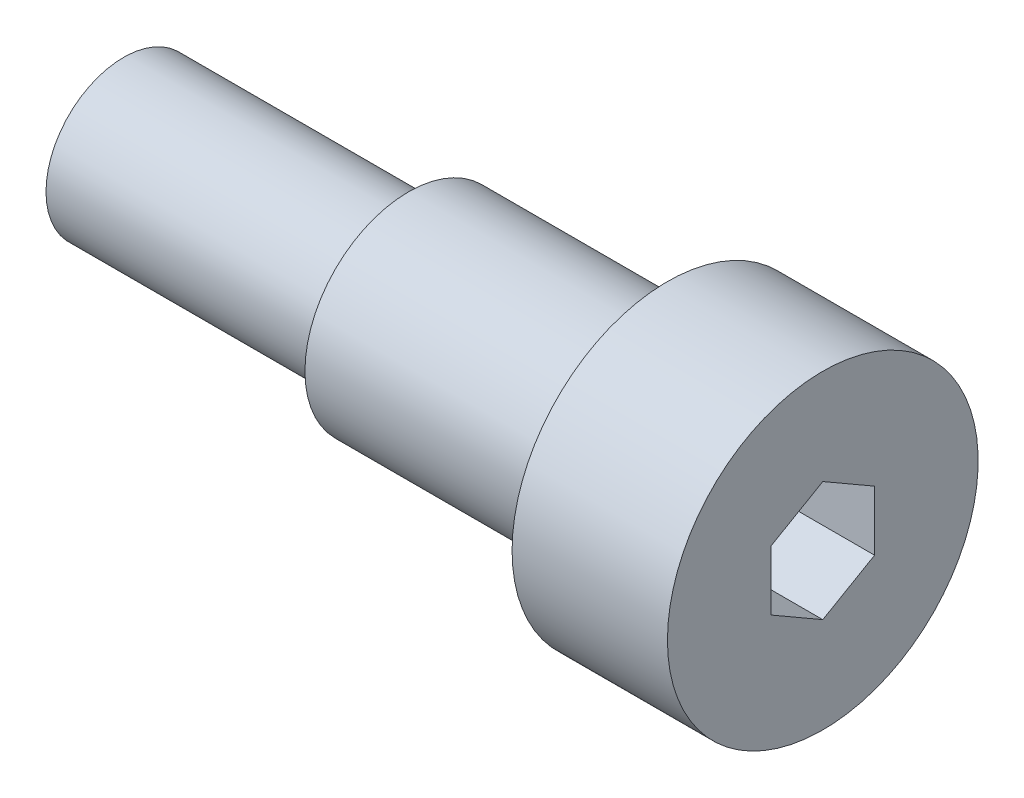
ISO-10303-21;
HEADER;
FILE_DESCRIPTION(('STEP AP214'),'2;1');
FILE_NAME('part.step','',(''),(''),'','','');
FILE_SCHEMA(('AUTOMOTIVE_DESIGN { 1 0 10303 214 1 1 1 1 }'));
ENDSEC;
DATA;
#1=APPLICATION_CONTEXT('core data for automotive mechanical design processes');
#2=APPLICATION_PROTOCOL_DEFINITION('international standard','automotive_design',2000,#1);
#3=PRODUCT_CONTEXT('',#1,'mechanical');
#4=PRODUCT('Part','Part','',(#3));
#5=PRODUCT_RELATED_PRODUCT_CATEGORY('part','',(#4));
#6=PRODUCT_DEFINITION_FORMATION('','',#4);
#7=PRODUCT_DEFINITION_CONTEXT('part definition',#1,'design');
#8=PRODUCT_DEFINITION('design','',#6,#7);
#9=PRODUCT_DEFINITION_SHAPE('','',#8);
#10=(LENGTH_UNIT() NAMED_UNIT(*) SI_UNIT(.MILLI.,.METRE.));
#11=(NAMED_UNIT(*) PLANE_ANGLE_UNIT() SI_UNIT($,.RADIAN.));
#12=(NAMED_UNIT(*) SI_UNIT($,.STERADIAN.) SOLID_ANGLE_UNIT());
#13=UNCERTAINTY_MEASURE_WITH_UNIT(LENGTH_MEASURE(1.E-05),#10,'distance_accuracy_value','');
#14=(GEOMETRIC_REPRESENTATION_CONTEXT(3) GLOBAL_UNCERTAINTY_ASSIGNED_CONTEXT((#13)) GLOBAL_UNIT_ASSIGNED_CONTEXT((#10,
#11,#12)) REPRESENTATION_CONTEXT('',''));
#15=CARTESIAN_POINT('',(0.,0.,0.));
#16=DIRECTION('',(0.,0.,1.));
#17=DIRECTION('',(1.,0.,0.));
#18=AXIS2_PLACEMENT_3D('',#15,#16,#17);
#19=CARTESIAN_POINT('',(16.,0.,0.));
#20=DIRECTION('',(-1.,0.,0.));
#21=DIRECTION('',(0.,0.,1.));
#22=AXIS2_PLACEMENT_3D('',#19,#20,#21);
#23=PLANE('',#22);
#24=DIRECTION('',(0.,-0.5,0.866025403784439));
#25=VECTOR('',#24,1.);
#26=CARTESIAN_POINT('',(16.,2.3094010767585,0.));
#27=LINE('',#26,#25);
#28=CARTESIAN_POINT('',(16.,2.3094010767585,0.));
#29=VERTEX_POINT('',#28);
#30=CARTESIAN_POINT('',(16.,1.15470053837925,2.));
#31=VERTEX_POINT('',#30);
#32=EDGE_CURVE('E125',#29,#31,#27,.T.);
#33=ORIENTED_EDGE('',*,*,#32,.F.);
#34=DIRECTION('',(0.,0.5,0.866025403784439));
#35=VECTOR('',#34,1.);
#36=CARTESIAN_POINT('',(16.,1.15470053837925,-2.));
#37=LINE('',#36,#35);
#38=CARTESIAN_POINT('',(16.,1.15470053837925,-2.));
#39=VERTEX_POINT('',#38);
#40=EDGE_CURVE('E51',#39,#29,#37,.T.);
#41=ORIENTED_EDGE('',*,*,#40,.F.);
#42=DIRECTION('',(0.,1.,0.));
#43=VECTOR('',#42,1.);
#44=CARTESIAN_POINT('',(16.,-1.15470053837925,-2.));
#45=LINE('',#44,#43);
#46=CARTESIAN_POINT('',(16.,-1.15470053837925,-2.));
#47=VERTEX_POINT('',#46);
#48=EDGE_CURVE('E134',#47,#39,#45,.T.);
#49=ORIENTED_EDGE('',*,*,#48,.F.);
#50=DIRECTION('',(0.,0.5,-0.866025403784439));
#51=VECTOR('',#50,1.);
#52=CARTESIAN_POINT('',(16.,-2.3094010767585,0.));
#53=LINE('',#52,#51);
#54=CARTESIAN_POINT('',(16.,-2.3094010767585,0.));
#55=VERTEX_POINT('',#54);
#56=EDGE_CURVE('E132',#55,#47,#53,.T.);
#57=ORIENTED_EDGE('',*,*,#56,.F.);
#58=DIRECTION('',(0.,-0.5,-0.866025403784439));
#59=VECTOR('',#58,1.);
#60=CARTESIAN_POINT('',(16.,-1.15470053837925,2.));
#61=LINE('',#60,#59);
#62=CARTESIAN_POINT('',(16.,-1.15470053837925,2.));
#63=VERTEX_POINT('',#62);
#64=EDGE_CURVE('E99',#63,#55,#61,.T.);
#65=ORIENTED_EDGE('',*,*,#64,.F.);
#66=DIRECTION('',(0.,-1.,0.));
#67=VECTOR('',#66,1.);
#68=CARTESIAN_POINT('',(16.,1.15470053837925,2.));
#69=LINE('',#68,#67);
#70=EDGE_CURVE('E128',#31,#63,#69,.T.);
#71=ORIENTED_EDGE('',*,*,#70,.F.);
#72=EDGE_LOOP('',(#33,#41,#49,#57,#65,#71));
#73=FACE_BOUND('',#72,.T.);
#74=CARTESIAN_POINT('',(16.,0.,0.));
#75=DIRECTION('',(-1.,0.,0.));
#76=DIRECTION('',(0.,0.,1.));
#77=AXIS2_PLACEMENT_3D('',#74,#75,#76);
#78=CIRCLE('',#77,6.);
#79=CARTESIAN_POINT('',(16.,0.,6.));
#80=VERTEX_POINT('',#79);
#81=EDGE_CURVE('E11',#80,#80,#78,.T.);
#82=ORIENTED_EDGE('',*,*,#81,.F.);
#83=EDGE_LOOP('',(#82));
#84=FACE_BOUND('',#83,.T.);
#85=ADVANCED_FACE('F37',(#73,#84),#23,.F.);
#86=CARTESIAN_POINT('',(0.,0.,0.));
#87=DIRECTION('',(-1.,0.,0.));
#88=DIRECTION('',(0.,0.,1.));
#89=AXIS2_PLACEMENT_3D('',#86,#87,#88);
#90=CYLINDRICAL_SURFACE('',#89,6.);
#91=CARTESIAN_POINT('',(10.,0.,0.));
#92=DIRECTION('',(-1.,0.,0.));
#93=DIRECTION('',(0.,0.,1.));
#94=AXIS2_PLACEMENT_3D('',#91,#92,#93);
#95=CIRCLE('',#94,6.);
#96=CARTESIAN_POINT('',(10.,0.,6.));
#97=VERTEX_POINT('',#96);
#98=EDGE_CURVE('E44',#97,#97,#95,.T.);
#99=ORIENTED_EDGE('',*,*,#98,.F.);
#100=EDGE_LOOP('',(#99));
#101=FACE_BOUND('',#100,.T.);
#102=ORIENTED_EDGE('',*,*,#81,.T.);
#103=EDGE_LOOP('',(#102));
#104=FACE_BOUND('',#103,.T.);
#105=ADVANCED_FACE('F159',(#101,#104),#90,.T.);
#106=CARTESIAN_POINT('',(10.,6.,0.));
#107=DIRECTION('',(1.,0.,0.));
#108=DIRECTION('',(0.,0.,-1.));
#109=AXIS2_PLACEMENT_3D('',#106,#107,#108);
#110=PLANE('',#109);
#111=CARTESIAN_POINT('',(10.,0.,0.));
#112=DIRECTION('',(-1.,0.,0.));
#113=DIRECTION('',(0.,0.,1.));
#114=AXIS2_PLACEMENT_3D('',#111,#112,#113);
#115=CIRCLE('',#114,4.);
#116=CARTESIAN_POINT('',(10.,0.,4.));
#117=VERTEX_POINT('',#116);
#118=EDGE_CURVE('E152',#117,#117,#115,.T.);
#119=ORIENTED_EDGE('',*,*,#118,.F.);
#120=EDGE_LOOP('',(#119));
#121=FACE_BOUND('',#120,.T.);
#122=ORIENTED_EDGE('',*,*,#98,.T.);
#123=EDGE_LOOP('',(#122));
#124=FACE_BOUND('',#123,.T.);
#125=ADVANCED_FACE('F157',(#121,#124),#110,.F.);
#126=CARTESIAN_POINT('',(0.,0.,0.));
#127=DIRECTION('',(-1.,0.,0.));
#128=DIRECTION('',(0.,0.,1.));
#129=AXIS2_PLACEMENT_3D('',#126,#127,#128);
#130=CYLINDRICAL_SURFACE('',#129,4.);
#131=CARTESIAN_POINT('',(0.,0.,0.));
#132=DIRECTION('',(-1.,0.,0.));
#133=DIRECTION('',(0.,0.,1.));
#134=AXIS2_PLACEMENT_3D('',#131,#132,#133);
#135=CIRCLE('',#134,4.);
#136=CARTESIAN_POINT('',(0.,0.,4.));
#137=VERTEX_POINT('',#136);
#138=EDGE_CURVE('E149',#137,#137,#135,.T.);
#139=ORIENTED_EDGE('',*,*,#138,.F.);
#140=EDGE_LOOP('',(#139));
#141=FACE_BOUND('',#140,.T.);
#142=ORIENTED_EDGE('',*,*,#118,.T.);
#143=EDGE_LOOP('',(#142));
#144=FACE_BOUND('',#143,.T.);
#145=ADVANCED_FACE('F196',(#141,#144),#130,.T.);
#146=CARTESIAN_POINT('',(0.,4.,0.));
#147=DIRECTION('',(1.,0.,0.));
#148=DIRECTION('',(0.,0.,-1.));
#149=AXIS2_PLACEMENT_3D('',#146,#147,#148);
#150=PLANE('',#149);
#151=CARTESIAN_POINT('',(0.,0.,0.));
#152=DIRECTION('',(-1.,0.,0.));
#153=DIRECTION('',(0.,0.,1.));
#154=AXIS2_PLACEMENT_3D('',#151,#152,#153);
#155=CIRCLE('',#154,3.);
#156=CARTESIAN_POINT('',(0.,0.,3.));
#157=VERTEX_POINT('',#156);
#158=EDGE_CURVE('E146',#157,#157,#155,.T.);
#159=ORIENTED_EDGE('',*,*,#158,.F.);
#160=EDGE_LOOP('',(#159));
#161=FACE_BOUND('',#160,.T.);
#162=ORIENTED_EDGE('',*,*,#138,.T.);
#163=EDGE_LOOP('',(#162));
#164=FACE_BOUND('',#163,.T.);
#165=ADVANCED_FACE('F192',(#161,#164),#150,.F.);
#166=CARTESIAN_POINT('',(0.,0.,0.));
#167=DIRECTION('',(-1.,0.,0.));
#168=DIRECTION('',(0.,0.,1.));
#169=AXIS2_PLACEMENT_3D('',#166,#167,#168);
#170=CYLINDRICAL_SURFACE('',#169,3.);
#171=CARTESIAN_POINT('',(-11.,0.,0.));
#172=DIRECTION('',(-1.,0.,0.));
#173=DIRECTION('',(0.,0.,1.));
#174=AXIS2_PLACEMENT_3D('',#171,#172,#173);
#175=CIRCLE('',#174,3.);
#176=CARTESIAN_POINT('',(-11.,0.,3.));
#177=VERTEX_POINT('',#176);
#178=EDGE_CURVE('E138',#177,#177,#175,.T.);
#179=ORIENTED_EDGE('',*,*,#178,.F.);
#180=EDGE_LOOP('',(#179));
#181=FACE_BOUND('',#180,.T.);
#182=ORIENTED_EDGE('',*,*,#158,.T.);
#183=EDGE_LOOP('',(#182));
#184=FACE_BOUND('',#183,.T.);
#185=ADVANCED_FACE('F184',(#181,#184),#170,.T.);
#186=CARTESIAN_POINT('',(-11.,3.,0.));
#187=DIRECTION('',(1.,0.,0.));
#188=DIRECTION('',(0.,0.,-1.));
#189=AXIS2_PLACEMENT_3D('',#186,#187,#188);
#190=PLANE('',#189);
#191=ORIENTED_EDGE('',*,*,#178,.T.);
#192=EDGE_LOOP('',(#191));
#193=FACE_BOUND('',#192,.T.);
#194=ADVANCED_FACE('F177',(#193),#190,.F.);
#195=CARTESIAN_POINT('',(12.,1.15470053837925,-2.));
#196=DIRECTION('',(0.,0.866025403784439,-0.5));
#197=DIRECTION('',(0.,0.5,0.866025403784439));
#198=AXIS2_PLACEMENT_3D('',#195,#196,#197);
#199=PLANE('',#198);
#200=ORIENTED_EDGE('',*,*,#40,.T.);
#201=DIRECTION('',(1.,0.,0.));
#202=VECTOR('',#201,1.);
#203=CARTESIAN_POINT('',(12.,2.3094010767585,0.));
#204=LINE('',#203,#202);
#205=CARTESIAN_POINT('',(12.,2.3094010767585,0.));
#206=VERTEX_POINT('',#205);
#207=EDGE_CURVE('E81',#206,#29,#204,.T.);
#208=ORIENTED_EDGE('',*,*,#207,.F.);
#209=DIRECTION('',(0.,0.5,0.866025403784439));
#210=VECTOR('',#209,1.);
#211=CARTESIAN_POINT('',(12.,1.15470053837925,-2.));
#212=LINE('',#211,#210);
#213=CARTESIAN_POINT('',(12.,1.15470053837925,-2.));
#214=VERTEX_POINT('',#213);
#215=EDGE_CURVE('E136',#214,#206,#212,.T.);
#216=ORIENTED_EDGE('',*,*,#215,.F.);
#217=DIRECTION('',(1.,0.,0.));
#218=VECTOR('',#217,1.);
#219=CARTESIAN_POINT('',(12.,1.15470053837925,-2.));
#220=LINE('',#219,#218);
#221=EDGE_CURVE('E59',#214,#39,#220,.T.);
#222=ORIENTED_EDGE('',*,*,#221,.T.);
#223=EDGE_LOOP('',(#200,#208,#216,#222));
#224=FACE_BOUND('',#223,.T.);
#225=ADVANCED_FACE('F174',(#224),#199,.F.);
#226=CARTESIAN_POINT('',(12.,-1.15470053837925,-2.));
#227=DIRECTION('',(0.,0.,-1.));
#228=DIRECTION('',(-1.,0.,0.));
#229=AXIS2_PLACEMENT_3D('',#226,#227,#228);
#230=PLANE('',#229);
#231=ORIENTED_EDGE('',*,*,#48,.T.);
#232=ORIENTED_EDGE('',*,*,#221,.F.);
#233=DIRECTION('',(0.,1.,0.));
#234=VECTOR('',#233,1.);
#235=CARTESIAN_POINT('',(12.,-1.15470053837925,-2.));
#236=LINE('',#235,#234);
#237=CARTESIAN_POINT('',(12.,-1.15470053837925,-2.));
#238=VERTEX_POINT('',#237);
#239=EDGE_CURVE('E111',#238,#214,#236,.T.);
#240=ORIENTED_EDGE('',*,*,#239,.F.);
#241=DIRECTION('',(1.,0.,0.));
#242=VECTOR('',#241,1.);
#243=CARTESIAN_POINT('',(12.,-1.15470053837925,-2.));
#244=LINE('',#243,#242);
#245=EDGE_CURVE('E103',#238,#47,#244,.T.);
#246=ORIENTED_EDGE('',*,*,#245,.T.);
#247=EDGE_LOOP('',(#231,#232,#240,#246));
#248=FACE_BOUND('',#247,.T.);
#249=ADVANCED_FACE('F176',(#248),#230,.F.);
#250=CARTESIAN_POINT('',(12.,-2.3094010767585,0.));
#251=DIRECTION('',(0.,-0.866025403784439,-0.5));
#252=DIRECTION('',(0.,0.5,-0.866025403784439));
#253=AXIS2_PLACEMENT_3D('',#250,#251,#252);
#254=PLANE('',#253);
#255=ORIENTED_EDGE('',*,*,#56,.T.);
#256=ORIENTED_EDGE('',*,*,#245,.F.);
#257=DIRECTION('',(0.,0.5,-0.866025403784439));
#258=VECTOR('',#257,1.);
#259=CARTESIAN_POINT('',(12.,-2.3094010767585,0.));
#260=LINE('',#259,#258);
#261=CARTESIAN_POINT('',(12.,-2.3094010767585,0.));
#262=VERTEX_POINT('',#261);
#263=EDGE_CURVE('E107',#262,#238,#260,.T.);
#264=ORIENTED_EDGE('',*,*,#263,.F.);
#265=DIRECTION('',(1.,0.,0.));
#266=VECTOR('',#265,1.);
#267=CARTESIAN_POINT('',(12.,-2.3094010767585,0.));
#268=LINE('',#267,#266);
#269=EDGE_CURVE('E92',#262,#55,#268,.T.);
#270=ORIENTED_EDGE('',*,*,#269,.T.);
#271=EDGE_LOOP('',(#255,#256,#264,#270));
#272=FACE_BOUND('',#271,.T.);
#273=ADVANCED_FACE('F108',(#272),#254,.F.);
#274=CARTESIAN_POINT('',(12.,-1.15470053837925,2.));
#275=DIRECTION('',(0.,-0.866025403784439,0.5));
#276=DIRECTION('',(0.,-0.5,-0.866025403784439));
#277=AXIS2_PLACEMENT_3D('',#274,#275,#276);
#278=PLANE('',#277);
#279=ORIENTED_EDGE('',*,*,#64,.T.);
#280=ORIENTED_EDGE('',*,*,#269,.F.);
#281=DIRECTION('',(0.,-0.5,-0.866025403784439));
#282=VECTOR('',#281,1.);
#283=CARTESIAN_POINT('',(12.,-1.15470053837925,2.));
#284=LINE('',#283,#282);
#285=CARTESIAN_POINT('',(12.,-1.15470053837925,2.));
#286=VERTEX_POINT('',#285);
#287=EDGE_CURVE('E96',#286,#262,#284,.T.);
#288=ORIENTED_EDGE('',*,*,#287,.F.);
#289=DIRECTION('',(1.,0.,0.));
#290=VECTOR('',#289,1.);
#291=CARTESIAN_POINT('',(12.,-1.15470053837925,2.));
#292=LINE('',#291,#290);
#293=EDGE_CURVE('E104',#286,#63,#292,.T.);
#294=ORIENTED_EDGE('',*,*,#293,.T.);
#295=EDGE_LOOP('',(#279,#280,#288,#294));
#296=FACE_BOUND('',#295,.T.);
#297=ADVANCED_FACE('F94',(#296),#278,.F.);
#298=CARTESIAN_POINT('',(12.,1.15470053837925,2.));
#299=DIRECTION('',(0.,0.,1.));
#300=DIRECTION('',(1.,0.,0.));
#301=AXIS2_PLACEMENT_3D('',#298,#299,#300);
#302=PLANE('',#301);
#303=ORIENTED_EDGE('',*,*,#70,.T.);
#304=ORIENTED_EDGE('',*,*,#293,.F.);
#305=DIRECTION('',(0.,-1.,0.));
#306=VECTOR('',#305,1.);
#307=CARTESIAN_POINT('',(12.,1.15470053837925,2.));
#308=LINE('',#307,#306);
#309=CARTESIAN_POINT('',(12.,1.15470053837925,2.));
#310=VERTEX_POINT('',#309);
#311=EDGE_CURVE('E117',#310,#286,#308,.T.);
#312=ORIENTED_EDGE('',*,*,#311,.F.);
#313=DIRECTION('',(1.,0.,0.));
#314=VECTOR('',#313,1.);
#315=CARTESIAN_POINT('',(12.,1.15470053837925,2.));
#316=LINE('',#315,#314);
#317=EDGE_CURVE('E141',#310,#31,#316,.T.);
#318=ORIENTED_EDGE('',*,*,#317,.T.);
#319=EDGE_LOOP('',(#303,#304,#312,#318));
#320=FACE_BOUND('',#319,.T.);
#321=ADVANCED_FACE('F259',(#320),#302,.F.);
#322=CARTESIAN_POINT('',(12.,2.3094010767585,0.));
#323=DIRECTION('',(0.,0.866025403784439,0.5));
#324=DIRECTION('',(0.,-0.5,0.866025403784439));
#325=AXIS2_PLACEMENT_3D('',#322,#323,#324);
#326=PLANE('',#325);
#327=ORIENTED_EDGE('',*,*,#32,.T.);
#328=ORIENTED_EDGE('',*,*,#317,.F.);
#329=DIRECTION('',(0.,-0.5,0.866025403784439));
#330=VECTOR('',#329,1.);
#331=CARTESIAN_POINT('',(12.,2.3094010767585,0.));
#332=LINE('',#331,#330);
#333=EDGE_CURVE('E119',#206,#310,#332,.T.);
#334=ORIENTED_EDGE('',*,*,#333,.F.);
#335=ORIENTED_EDGE('',*,*,#207,.T.);
#336=EDGE_LOOP('',(#327,#328,#334,#335));
#337=FACE_BOUND('',#336,.T.);
#338=ADVANCED_FACE('F172',(#337),#326,.F.);
#339=CARTESIAN_POINT('',(12.,3.46410161513775,2.));
#340=DIRECTION('',(1.,0.,0.));
#341=DIRECTION('',(0.,0.,-1.));
#342=AXIS2_PLACEMENT_3D('',#339,#340,#341);
#343=PLANE('',#342);
#344=ORIENTED_EDGE('',*,*,#215,.T.);
#345=ORIENTED_EDGE('',*,*,#333,.T.);
#346=ORIENTED_EDGE('',*,*,#311,.T.);
#347=ORIENTED_EDGE('',*,*,#287,.T.);
#348=ORIENTED_EDGE('',*,*,#263,.T.);
#349=ORIENTED_EDGE('',*,*,#239,.T.);
#350=EDGE_LOOP('',(#344,#345,#346,#347,#348,#349));
#351=FACE_BOUND('',#350,.T.);
#352=ADVANCED_FACE('F114',(#351),#343,.T.);
#353=CLOSED_SHELL('',(#85,#105,#125,#145,#165,#185,#194,#225,#249,#273,#297,#321,#338,#352));
#354=MANIFOLD_SOLID_BREP('B2',#353);
#355=ADVANCED_BREP_SHAPE_REPRESENTATION('',(#18,#354),#14);
#356=SHAPE_DEFINITION_REPRESENTATION(#9,#355);
ENDSEC;
END-ISO-10303-21;
